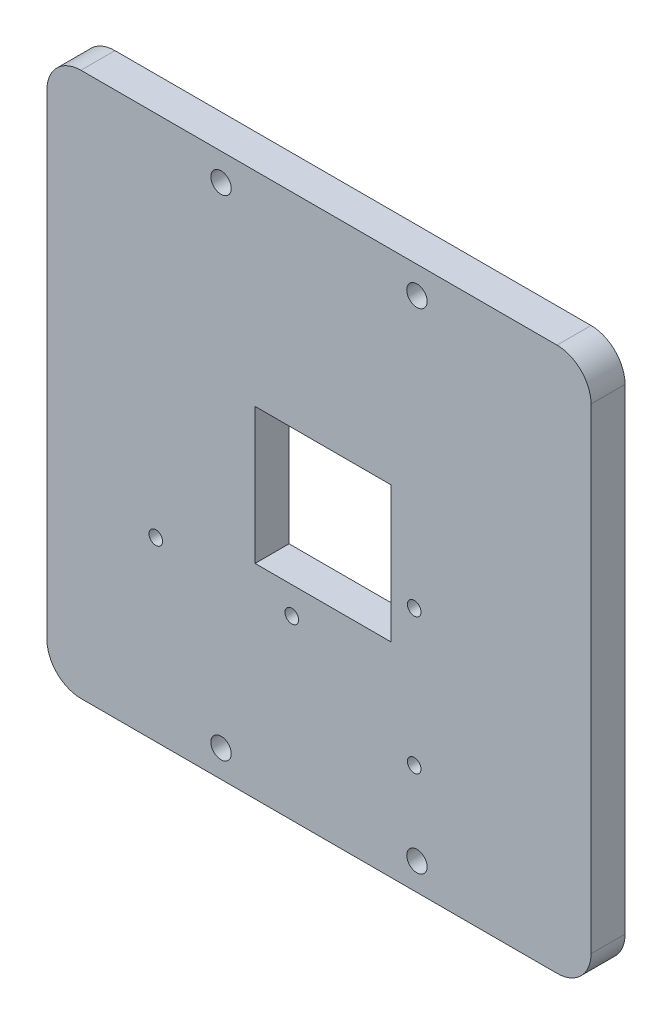
ISO-10303-21;
HEADER;
FILE_DESCRIPTION(('STEP AP214'),'2;1');
FILE_NAME('part.step','',(''),(''),'','','');
FILE_SCHEMA(('AUTOMOTIVE_DESIGN { 1 0 10303 214 1 1 1 1 }'));
ENDSEC;
DATA;
#1=APPLICATION_CONTEXT('core data for automotive mechanical design processes');
#2=APPLICATION_PROTOCOL_DEFINITION('international standard','automotive_design',2000,#1);
#3=PRODUCT_CONTEXT('',#1,'mechanical');
#4=PRODUCT('Part','Part','',(#3));
#5=PRODUCT_RELATED_PRODUCT_CATEGORY('part','',(#4));
#6=PRODUCT_DEFINITION_FORMATION('','',#4);
#7=PRODUCT_DEFINITION_CONTEXT('part definition',#1,'design');
#8=PRODUCT_DEFINITION('design','',#6,#7);
#9=PRODUCT_DEFINITION_SHAPE('','',#8);
#10=(LENGTH_UNIT() NAMED_UNIT(*) SI_UNIT(.MILLI.,.METRE.));
#11=(NAMED_UNIT(*) PLANE_ANGLE_UNIT() SI_UNIT($,.RADIAN.));
#12=(NAMED_UNIT(*) SI_UNIT($,.STERADIAN.) SOLID_ANGLE_UNIT());
#13=UNCERTAINTY_MEASURE_WITH_UNIT(LENGTH_MEASURE(1.E-05),#10,'distance_accuracy_value','');
#14=(GEOMETRIC_REPRESENTATION_CONTEXT(3) GLOBAL_UNCERTAINTY_ASSIGNED_CONTEXT((#13)) GLOBAL_UNIT_ASSIGNED_CONTEXT((#10,
#11,#12)) REPRESENTATION_CONTEXT('',''));
#15=CARTESIAN_POINT('',(0.,0.,0.));
#16=DIRECTION('',(0.,0.,1.));
#17=DIRECTION('',(1.,0.,0.));
#18=AXIS2_PLACEMENT_3D('',#15,#16,#17);
#19=CARTESIAN_POINT('',(5.,5.,5.));
#20=DIRECTION('',(0.,0.,-1.));
#21=DIRECTION('',(-1.,0.,0.));
#22=AXIS2_PLACEMENT_3D('',#19,#20,#21);
#23=PLANE('',#22);
#24=CARTESIAN_POINT('',(54.,36.,5.));
#25=DIRECTION('',(0.,0.,1.));
#26=DIRECTION('',(1.,0.,0.));
#27=AXIS2_PLACEMENT_3D('',#24,#25,#26);
#28=CIRCLE('',#27,0.999999999999998);
#29=CARTESIAN_POINT('',(55.,36.,5.));
#30=VERTEX_POINT('',#29);
#31=EDGE_CURVE('E512',#30,#30,#28,.T.);
#32=ORIENTED_EDGE('',*,*,#31,.F.);
#33=EDGE_LOOP('',(#32));
#34=FACE_BOUND('',#33,.T.);
#35=CARTESIAN_POINT('',(54.,16.,5.));
#36=DIRECTION('',(0.,0.,1.));
#37=DIRECTION('',(1.,0.,0.));
#38=AXIS2_PLACEMENT_3D('',#35,#36,#37);
#39=CIRCLE('',#38,0.999999999999998);
#40=CARTESIAN_POINT('',(55.,16.,5.));
#41=VERTEX_POINT('',#40);
#42=EDGE_CURVE('E517',#41,#41,#39,.T.);
#43=ORIENTED_EDGE('',*,*,#42,.F.);
#44=EDGE_LOOP('',(#43));
#45=FACE_BOUND('',#44,.T.);
#46=CARTESIAN_POINT('',(36.,26.,5.));
#47=DIRECTION('',(0.,0.,1.));
#48=DIRECTION('',(1.,0.,0.));
#49=AXIS2_PLACEMENT_3D('',#46,#47,#48);
#50=CIRCLE('',#49,0.999999999999998);
#51=CARTESIAN_POINT('',(37.,26.,5.));
#52=VERTEX_POINT('',#51);
#53=EDGE_CURVE('E525',#52,#52,#50,.T.);
#54=ORIENTED_EDGE('',*,*,#53,.F.);
#55=EDGE_LOOP('',(#54));
#56=FACE_BOUND('',#55,.T.);
#57=CARTESIAN_POINT('',(16.,26.,5.));
#58=DIRECTION('',(0.,0.,1.));
#59=DIRECTION('',(1.,0.,0.));
#60=AXIS2_PLACEMENT_3D('',#57,#58,#59);
#61=CIRCLE('',#60,1.);
#62=CARTESIAN_POINT('',(17.,26.,5.));
#63=VERTEX_POINT('',#62);
#64=EDGE_CURVE('E146',#63,#63,#61,.T.);
#65=ORIENTED_EDGE('',*,*,#64,.F.);
#66=EDGE_LOOP('',(#65));
#67=FACE_BOUND('',#66,.T.);
#68=DIRECTION('',(1.,0.,0.));
#69=VECTOR('',#68,1.);
#70=CARTESIAN_POINT('',(30.6,30.,5.));
#71=LINE('',#70,#69);
#72=CARTESIAN_POINT('',(30.6,30.,5.));
#73=VERTEX_POINT('',#72);
#74=CARTESIAN_POINT('',(50.6,30.,5.));
#75=VERTEX_POINT('',#74);
#76=EDGE_CURVE('E152',#73,#75,#71,.T.);
#77=ORIENTED_EDGE('',*,*,#76,.F.);
#78=DIRECTION('',(0.,-1.,0.));
#79=VECTOR('',#78,1.);
#80=CARTESIAN_POINT('',(30.6,50.,5.));
#81=LINE('',#80,#79);
#82=CARTESIAN_POINT('',(30.6,50.,5.));
#83=VERTEX_POINT('',#82);
#84=EDGE_CURVE('E48',#83,#73,#81,.T.);
#85=ORIENTED_EDGE('',*,*,#84,.F.);
#86=DIRECTION('',(-1.,0.,0.));
#87=VECTOR('',#86,1.);
#88=CARTESIAN_POINT('',(30.6,50.,5.));
#89=LINE('',#88,#87);
#90=CARTESIAN_POINT('',(50.6,50.,5.));
#91=VERTEX_POINT('',#90);
#92=EDGE_CURVE('E140',#91,#83,#89,.T.);
#93=ORIENTED_EDGE('',*,*,#92,.F.);
#94=DIRECTION('',(0.,1.,0.));
#95=VECTOR('',#94,1.);
#96=CARTESIAN_POINT('',(50.6,50.,5.));
#97=LINE('',#96,#95);
#98=EDGE_CURVE('E143',#75,#91,#97,.T.);
#99=ORIENTED_EDGE('',*,*,#98,.F.);
#100=EDGE_LOOP('',(#77,#85,#93,#99));
#101=FACE_BOUND('',#100,.T.);
#102=DIRECTION('',(-1.,0.,0.));
#103=VECTOR('',#102,1.);
#104=CARTESIAN_POINT('',(5.00000000000004,80.,5.));
#105=LINE('',#104,#103);
#106=CARTESIAN_POINT('',(74.9999999999999,80.,5.));
#107=VERTEX_POINT('',#106);
#108=CARTESIAN_POINT('',(5.00000000000003,80.,5.));
#109=VERTEX_POINT('',#108);
#110=EDGE_CURVE('E215',#107,#109,#105,.T.);
#111=ORIENTED_EDGE('',*,*,#110,.T.);
#112=CARTESIAN_POINT('',(5.,75.,5.));
#113=DIRECTION('',(0.,0.,1.));
#114=DIRECTION('',(-1.,0.,0.));
#115=AXIS2_PLACEMENT_3D('',#112,#113,#114);
#116=CIRCLE('',#115,5.);
#117=CARTESIAN_POINT('',(0.,75.,5.));
#118=VERTEX_POINT('',#117);
#119=EDGE_CURVE('E218',#109,#118,#116,.T.);
#120=ORIENTED_EDGE('',*,*,#119,.T.);
#121=DIRECTION('',(0.,-1.,0.));
#122=VECTOR('',#121,1.);
#123=CARTESIAN_POINT('',(0.,5.00000000000004,5.));
#124=LINE('',#123,#122);
#125=CARTESIAN_POINT('',(0.,5.,5.));
#126=VERTEX_POINT('',#125);
#127=EDGE_CURVE('E221',#118,#126,#124,.T.);
#128=ORIENTED_EDGE('',*,*,#127,.T.);
#129=CARTESIAN_POINT('',(5.,5.,5.));
#130=DIRECTION('',(0.,0.,1.));
#131=DIRECTION('',(-1.,0.,0.));
#132=AXIS2_PLACEMENT_3D('',#129,#130,#131);
#133=CIRCLE('',#132,5.);
#134=CARTESIAN_POINT('',(5.00000000000004,0.,5.));
#135=VERTEX_POINT('',#134);
#136=EDGE_CURVE('E223',#126,#135,#133,.T.);
#137=ORIENTED_EDGE('',*,*,#136,.T.);
#138=DIRECTION('',(1.,0.,0.));
#139=VECTOR('',#138,1.);
#140=CARTESIAN_POINT('',(5.00000000000004,0.,5.));
#141=LINE('',#140,#139);
#142=CARTESIAN_POINT('',(75.,0.,5.));
#143=VERTEX_POINT('',#142);
#144=EDGE_CURVE('E225',#135,#143,#141,.T.);
#145=ORIENTED_EDGE('',*,*,#144,.T.);
#146=CARTESIAN_POINT('',(75.,5.00000000000002,5.));
#147=DIRECTION('',(0.,0.,-1.));
#148=DIRECTION('',(1.,0.,0.));
#149=AXIS2_PLACEMENT_3D('',#146,#147,#148);
#150=CIRCLE('',#149,5.);
#151=CARTESIAN_POINT('',(80.,5.00000000000002,5.));
#152=VERTEX_POINT('',#151);
#153=EDGE_CURVE('E175',#152,#143,#150,.T.);
#154=ORIENTED_EDGE('',*,*,#153,.F.);
#155=DIRECTION('',(0.,-1.,0.));
#156=VECTOR('',#155,1.);
#157=CARTESIAN_POINT('',(80.,5.00000000000005,5.));
#158=LINE('',#157,#156);
#159=CARTESIAN_POINT('',(80.,75.,5.));
#160=VERTEX_POINT('',#159);
#161=EDGE_CURVE('E178',#160,#152,#158,.T.);
#162=ORIENTED_EDGE('',*,*,#161,.F.);
#163=CARTESIAN_POINT('',(75.,75.,5.));
#164=DIRECTION('',(0.,0.,-1.));
#165=DIRECTION('',(1.,0.,0.));
#166=AXIS2_PLACEMENT_3D('',#163,#164,#165);
#167=CIRCLE('',#166,5.);
#168=EDGE_CURVE('E182',#107,#160,#167,.T.);
#169=ORIENTED_EDGE('',*,*,#168,.F.);
#170=EDGE_LOOP('',(#111,#120,#128,#137,#145,#154,#162,#169));
#171=FACE_BOUND('',#170,.T.);
#172=CARTESIAN_POINT('',(25.6,76.,5.));
#173=DIRECTION('',(0.,0.,1.));
#174=DIRECTION('',(1.,0.,0.));
#175=AXIS2_PLACEMENT_3D('',#172,#173,#174);
#176=CIRCLE('',#175,1.5);
#177=CARTESIAN_POINT('',(27.1,76.,5.));
#178=VERTEX_POINT('',#177);
#179=EDGE_CURVE('E209',#178,#178,#176,.T.);
#180=ORIENTED_EDGE('',*,*,#179,.F.);
#181=EDGE_LOOP('',(#180));
#182=FACE_BOUND('',#181,.T.);
#183=CARTESIAN_POINT('',(25.6,4.,5.));
#184=DIRECTION('',(0.,0.,1.));
#185=DIRECTION('',(1.,0.,0.));
#186=AXIS2_PLACEMENT_3D('',#183,#184,#185);
#187=CIRCLE('',#186,1.5);
#188=CARTESIAN_POINT('',(27.1,4.,5.));
#189=VERTEX_POINT('',#188);
#190=EDGE_CURVE('E203',#189,#189,#187,.T.);
#191=ORIENTED_EDGE('',*,*,#190,.F.);
#192=EDGE_LOOP('',(#191));
#193=FACE_BOUND('',#192,.T.);
#194=CARTESIAN_POINT('',(54.4,4.00000000000001,5.));
#195=DIRECTION('',(0.,0.,-1.));
#196=DIRECTION('',(-1.,0.,0.));
#197=AXIS2_PLACEMENT_3D('',#194,#195,#196);
#198=CIRCLE('',#197,1.5);
#199=CARTESIAN_POINT('',(52.9,4.00000000000001,5.));
#200=VERTEX_POINT('',#199);
#201=EDGE_CURVE('E163',#200,#200,#198,.T.);
#202=ORIENTED_EDGE('',*,*,#201,.T.);
#203=EDGE_LOOP('',(#202));
#204=FACE_BOUND('',#203,.T.);
#205=CARTESIAN_POINT('',(54.4,76.,5.));
#206=DIRECTION('',(0.,0.,-1.));
#207=DIRECTION('',(-1.,0.,0.));
#208=AXIS2_PLACEMENT_3D('',#205,#206,#207);
#209=CIRCLE('',#208,1.5);
#210=CARTESIAN_POINT('',(52.9,76.,5.));
#211=VERTEX_POINT('',#210);
#212=EDGE_CURVE('E169',#211,#211,#209,.T.);
#213=ORIENTED_EDGE('',*,*,#212,.T.);
#214=EDGE_LOOP('',(#213));
#215=FACE_BOUND('',#214,.T.);
#216=ADVANCED_FACE('F33',(#34,#45,#56,#67,#101,#171,#182,#193,#204,#215),#23,.F.);
#217=CARTESIAN_POINT('',(5.,5.,0.));
#218=DIRECTION('',(0.,0.,-1.));
#219=DIRECTION('',(-1.,0.,0.));
#220=AXIS2_PLACEMENT_3D('',#217,#218,#219);
#221=PLANE('',#220);
#222=CARTESIAN_POINT('',(54.,36.,0.));
#223=DIRECTION('',(0.,0.,1.));
#224=DIRECTION('',(1.,0.,0.));
#225=AXIS2_PLACEMENT_3D('',#222,#223,#224);
#226=CIRCLE('',#225,0.999999999999998);
#227=CARTESIAN_POINT('',(55.,36.,0.));
#228=VERTEX_POINT('',#227);
#229=EDGE_CURVE('E153',#228,#228,#226,.T.);
#230=ORIENTED_EDGE('',*,*,#229,.T.);
#231=EDGE_LOOP('',(#230));
#232=FACE_BOUND('',#231,.T.);
#233=CARTESIAN_POINT('',(54.,16.,0.));
#234=DIRECTION('',(0.,0.,1.));
#235=DIRECTION('',(1.,0.,0.));
#236=AXIS2_PLACEMENT_3D('',#233,#234,#235);
#237=CIRCLE('',#236,0.999999999999998);
#238=CARTESIAN_POINT('',(55.,16.,0.));
#239=VERTEX_POINT('',#238);
#240=EDGE_CURVE('E513',#239,#239,#237,.T.);
#241=ORIENTED_EDGE('',*,*,#240,.T.);
#242=EDGE_LOOP('',(#241));
#243=FACE_BOUND('',#242,.T.);
#244=CARTESIAN_POINT('',(36.,26.,0.));
#245=DIRECTION('',(0.,0.,1.));
#246=DIRECTION('',(1.,0.,0.));
#247=AXIS2_PLACEMENT_3D('',#244,#245,#246);
#248=CIRCLE('',#247,0.999999999999998);
#249=CARTESIAN_POINT('',(37.,26.,0.));
#250=VERTEX_POINT('',#249);
#251=EDGE_CURVE('E522',#250,#250,#248,.T.);
#252=ORIENTED_EDGE('',*,*,#251,.T.);
#253=EDGE_LOOP('',(#252));
#254=FACE_BOUND('',#253,.T.);
#255=CARTESIAN_POINT('',(16.,26.,0.));
#256=DIRECTION('',(0.,0.,1.));
#257=DIRECTION('',(1.,0.,0.));
#258=AXIS2_PLACEMENT_3D('',#255,#256,#257);
#259=CIRCLE('',#258,1.);
#260=CARTESIAN_POINT('',(17.,26.,0.));
#261=VERTEX_POINT('',#260);
#262=EDGE_CURVE('E527',#261,#261,#259,.T.);
#263=ORIENTED_EDGE('',*,*,#262,.T.);
#264=EDGE_LOOP('',(#263));
#265=FACE_BOUND('',#264,.T.);
#266=DIRECTION('',(0.,-1.,0.));
#267=VECTOR('',#266,1.);
#268=CARTESIAN_POINT('',(30.6,50.,0.));
#269=LINE('',#268,#267);
#270=CARTESIAN_POINT('',(30.6,50.,0.));
#271=VERTEX_POINT('',#270);
#272=CARTESIAN_POINT('',(30.6,30.,0.));
#273=VERTEX_POINT('',#272);
#274=EDGE_CURVE('E124',#271,#273,#269,.T.);
#275=ORIENTED_EDGE('',*,*,#274,.T.);
#276=DIRECTION('',(1.,0.,0.));
#277=VECTOR('',#276,1.);
#278=CARTESIAN_POINT('',(30.6,30.,0.));
#279=LINE('',#278,#277);
#280=CARTESIAN_POINT('',(50.6,30.,0.));
#281=VERTEX_POINT('',#280);
#282=EDGE_CURVE('E133',#273,#281,#279,.T.);
#283=ORIENTED_EDGE('',*,*,#282,.T.);
#284=DIRECTION('',(0.,1.,0.));
#285=VECTOR('',#284,1.);
#286=CARTESIAN_POINT('',(50.6,50.,0.));
#287=LINE('',#286,#285);
#288=CARTESIAN_POINT('',(50.6,50.,0.));
#289=VERTEX_POINT('',#288);
#290=EDGE_CURVE('E56',#281,#289,#287,.T.);
#291=ORIENTED_EDGE('',*,*,#290,.T.);
#292=DIRECTION('',(-1.,0.,0.));
#293=VECTOR('',#292,1.);
#294=CARTESIAN_POINT('',(30.6,50.,0.));
#295=LINE('',#294,#293);
#296=EDGE_CURVE('E130',#289,#271,#295,.T.);
#297=ORIENTED_EDGE('',*,*,#296,.T.);
#298=EDGE_LOOP('',(#275,#283,#291,#297));
#299=FACE_BOUND('',#298,.T.);
#300=CARTESIAN_POINT('',(25.6,76.,0.));
#301=DIRECTION('',(0.,0.,1.));
#302=DIRECTION('',(1.,0.,0.));
#303=AXIS2_PLACEMENT_3D('',#300,#301,#302);
#304=CIRCLE('',#303,1.5);
#305=CARTESIAN_POINT('',(27.1,76.,0.));
#306=VERTEX_POINT('',#305);
#307=EDGE_CURVE('E206',#306,#306,#304,.T.);
#308=ORIENTED_EDGE('',*,*,#307,.T.);
#309=EDGE_LOOP('',(#308));
#310=FACE_BOUND('',#309,.T.);
#311=DIRECTION('',(-1.,0.,0.));
#312=VECTOR('',#311,1.);
#313=CARTESIAN_POINT('',(5.00000000000004,80.,0.));
#314=LINE('',#313,#312);
#315=CARTESIAN_POINT('',(74.9999999999999,80.,0.));
#316=VERTEX_POINT('',#315);
#317=CARTESIAN_POINT('',(5.00000000000003,80.,0.));
#318=VERTEX_POINT('',#317);
#319=EDGE_CURVE('E212',#316,#318,#314,.T.);
#320=ORIENTED_EDGE('',*,*,#319,.F.);
#321=CARTESIAN_POINT('',(75.,75.,0.));
#322=DIRECTION('',(0.,0.,-1.));
#323=DIRECTION('',(1.,0.,0.));
#324=AXIS2_PLACEMENT_3D('',#321,#322,#323);
#325=CIRCLE('',#324,5.);
#326=CARTESIAN_POINT('',(80.,75.,0.));
#327=VERTEX_POINT('',#326);
#328=EDGE_CURVE('E179',#316,#327,#325,.T.);
#329=ORIENTED_EDGE('',*,*,#328,.T.);
#330=DIRECTION('',(0.,-1.,0.));
#331=VECTOR('',#330,1.);
#332=CARTESIAN_POINT('',(80.,5.00000000000005,0.));
#333=LINE('',#332,#331);
#334=CARTESIAN_POINT('',(80.,5.00000000000002,0.));
#335=VERTEX_POINT('',#334);
#336=EDGE_CURVE('E188',#327,#335,#333,.T.);
#337=ORIENTED_EDGE('',*,*,#336,.T.);
#338=CARTESIAN_POINT('',(75.,5.00000000000002,0.));
#339=DIRECTION('',(0.,0.,-1.));
#340=DIRECTION('',(1.,0.,0.));
#341=AXIS2_PLACEMENT_3D('',#338,#339,#340);
#342=CIRCLE('',#341,5.);
#343=CARTESIAN_POINT('',(75.,0.,0.));
#344=VERTEX_POINT('',#343);
#345=EDGE_CURVE('E172',#335,#344,#342,.T.);
#346=ORIENTED_EDGE('',*,*,#345,.T.);
#347=DIRECTION('',(1.,0.,0.));
#348=VECTOR('',#347,1.);
#349=CARTESIAN_POINT('',(5.00000000000004,0.,0.));
#350=LINE('',#349,#348);
#351=CARTESIAN_POINT('',(5.00000000000004,0.,0.));
#352=VERTEX_POINT('',#351);
#353=EDGE_CURVE('E219',#352,#344,#350,.T.);
#354=ORIENTED_EDGE('',*,*,#353,.F.);
#355=CARTESIAN_POINT('',(5.,5.,0.));
#356=DIRECTION('',(0.,0.,1.));
#357=DIRECTION('',(-1.,0.,0.));
#358=AXIS2_PLACEMENT_3D('',#355,#356,#357);
#359=CIRCLE('',#358,5.);
#360=CARTESIAN_POINT('',(0.,5.,0.));
#361=VERTEX_POINT('',#360);
#362=EDGE_CURVE('E234',#361,#352,#359,.T.);
#363=ORIENTED_EDGE('',*,*,#362,.F.);
#364=DIRECTION('',(0.,-1.,0.));
#365=VECTOR('',#364,1.);
#366=CARTESIAN_POINT('',(0.,5.00000000000004,0.));
#367=LINE('',#366,#365);
#368=CARTESIAN_POINT('',(0.,75.,0.));
#369=VERTEX_POINT('',#368);
#370=EDGE_CURVE('E232',#369,#361,#367,.T.);
#371=ORIENTED_EDGE('',*,*,#370,.F.);
#372=CARTESIAN_POINT('',(5.,75.,0.));
#373=DIRECTION('',(0.,0.,1.));
#374=DIRECTION('',(-1.,0.,0.));
#375=AXIS2_PLACEMENT_3D('',#372,#373,#374);
#376=CIRCLE('',#375,5.);
#377=EDGE_CURVE('E230',#318,#369,#376,.T.);
#378=ORIENTED_EDGE('',*,*,#377,.F.);
#379=EDGE_LOOP('',(#320,#329,#337,#346,#354,#363,#371,#378));
#380=FACE_BOUND('',#379,.T.);
#381=CARTESIAN_POINT('',(25.6,4.,0.));
#382=DIRECTION('',(0.,0.,1.));
#383=DIRECTION('',(1.,0.,0.));
#384=AXIS2_PLACEMENT_3D('',#381,#382,#383);
#385=CIRCLE('',#384,1.5);
#386=CARTESIAN_POINT('',(27.1,4.,0.));
#387=VERTEX_POINT('',#386);
#388=EDGE_CURVE('E202',#387,#387,#385,.T.);
#389=ORIENTED_EDGE('',*,*,#388,.T.);
#390=EDGE_LOOP('',(#389));
#391=FACE_BOUND('',#390,.T.);
#392=CARTESIAN_POINT('',(54.4,4.00000000000001,0.));
#393=DIRECTION('',(0.,0.,-1.));
#394=DIRECTION('',(-1.,0.,0.));
#395=AXIS2_PLACEMENT_3D('',#392,#393,#394);
#396=CIRCLE('',#395,1.5);
#397=CARTESIAN_POINT('',(52.9,4.00000000000001,0.));
#398=VERTEX_POINT('',#397);
#399=EDGE_CURVE('E159',#398,#398,#396,.T.);
#400=ORIENTED_EDGE('',*,*,#399,.F.);
#401=EDGE_LOOP('',(#400));
#402=FACE_BOUND('',#401,.T.);
#403=CARTESIAN_POINT('',(54.4,76.,0.));
#404=DIRECTION('',(0.,0.,-1.));
#405=DIRECTION('',(-1.,0.,0.));
#406=AXIS2_PLACEMENT_3D('',#403,#404,#405);
#407=CIRCLE('',#406,1.5);
#408=CARTESIAN_POINT('',(52.9,76.,0.));
#409=VERTEX_POINT('',#408);
#410=EDGE_CURVE('E166',#409,#409,#407,.T.);
#411=ORIENTED_EDGE('',*,*,#410,.F.);
#412=EDGE_LOOP('',(#411));
#413=FACE_BOUND('',#412,.T.);
#414=ADVANCED_FACE('F137',(#232,#243,#254,#265,#299,#310,#380,#391,#402,#413),#221,.T.);
#415=CARTESIAN_POINT('',(5.00000000000004,80.,5.));
#416=DIRECTION('',(0.,-1.,0.));
#417=DIRECTION('',(0.,0.,-1.));
#418=AXIS2_PLACEMENT_3D('',#415,#416,#417);
#419=PLANE('',#418);
#420=ORIENTED_EDGE('',*,*,#319,.T.);
#421=DIRECTION('',(0.,0.,-1.));
#422=VECTOR('',#421,1.);
#423=CARTESIAN_POINT('',(5.00000000000003,80.,5.));
#424=LINE('',#423,#422);
#425=EDGE_CURVE('E11',#109,#318,#424,.T.);
#426=ORIENTED_EDGE('',*,*,#425,.F.);
#427=ORIENTED_EDGE('',*,*,#110,.F.);
#428=DIRECTION('',(0.,0.,-1.));
#429=VECTOR('',#428,1.);
#430=CARTESIAN_POINT('',(74.9999999999999,80.,5.));
#431=LINE('',#430,#429);
#432=EDGE_CURVE('E185',#107,#316,#431,.T.);
#433=ORIENTED_EDGE('',*,*,#432,.T.);
#434=EDGE_LOOP('',(#420,#426,#427,#433));
#435=FACE_BOUND('',#434,.T.);
#436=ADVANCED_FACE('F35',(#435),#419,.F.);
#437=CARTESIAN_POINT('',(5.,75.,5.));
#438=DIRECTION('',(0.,0.,-1.));
#439=DIRECTION('',(-1.,0.,0.));
#440=AXIS2_PLACEMENT_3D('',#437,#438,#439);
#441=CYLINDRICAL_SURFACE('',#440,5.);
#442=ORIENTED_EDGE('',*,*,#377,.T.);
#443=DIRECTION('',(0.,0.,-1.));
#444=VECTOR('',#443,1.);
#445=CARTESIAN_POINT('',(0.,75.,5.));
#446=LINE('',#445,#444);
#447=EDGE_CURVE('E41',#118,#369,#446,.T.);
#448=ORIENTED_EDGE('',*,*,#447,.F.);
#449=ORIENTED_EDGE('',*,*,#119,.F.);
#450=ORIENTED_EDGE('',*,*,#425,.T.);
#451=EDGE_LOOP('',(#442,#448,#449,#450));
#452=FACE_BOUND('',#451,.T.);
#453=ADVANCED_FACE('F267',(#452),#441,.T.);
#454=CARTESIAN_POINT('',(0.,5.00000000000004,5.));
#455=DIRECTION('',(1.,0.,0.));
#456=DIRECTION('',(0.,0.,-1.));
#457=AXIS2_PLACEMENT_3D('',#454,#455,#456);
#458=PLANE('',#457);
#459=ORIENTED_EDGE('',*,*,#370,.T.);
#460=DIRECTION('',(0.,0.,-1.));
#461=VECTOR('',#460,1.);
#462=CARTESIAN_POINT('',(0.,5.,5.));
#463=LINE('',#462,#461);
#464=EDGE_CURVE('E239',#126,#361,#463,.T.);
#465=ORIENTED_EDGE('',*,*,#464,.F.);
#466=ORIENTED_EDGE('',*,*,#127,.F.);
#467=ORIENTED_EDGE('',*,*,#447,.T.);
#468=EDGE_LOOP('',(#459,#465,#466,#467));
#469=FACE_BOUND('',#468,.T.);
#470=ADVANCED_FACE('F246',(#469),#458,.F.);
#471=CARTESIAN_POINT('',(5.,5.,5.));
#472=DIRECTION('',(0.,0.,-1.));
#473=DIRECTION('',(-1.,0.,0.));
#474=AXIS2_PLACEMENT_3D('',#471,#472,#473);
#475=CYLINDRICAL_SURFACE('',#474,5.);
#476=ORIENTED_EDGE('',*,*,#362,.T.);
#477=DIRECTION('',(0.,0.,-1.));
#478=VECTOR('',#477,1.);
#479=CARTESIAN_POINT('',(5.00000000000004,0.,5.));
#480=LINE('',#479,#478);
#481=EDGE_CURVE('E227',#135,#352,#480,.T.);
#482=ORIENTED_EDGE('',*,*,#481,.F.);
#483=ORIENTED_EDGE('',*,*,#136,.F.);
#484=ORIENTED_EDGE('',*,*,#464,.T.);
#485=EDGE_LOOP('',(#476,#482,#483,#484));
#486=FACE_BOUND('',#485,.T.);
#487=ADVANCED_FACE('F255',(#486),#475,.T.);
#488=CARTESIAN_POINT('',(5.00000000000004,0.,5.));
#489=DIRECTION('',(0.,1.,0.));
#490=DIRECTION('',(0.,0.,1.));
#491=AXIS2_PLACEMENT_3D('',#488,#489,#490);
#492=PLANE('',#491);
#493=ORIENTED_EDGE('',*,*,#353,.T.);
#494=DIRECTION('',(0.,0.,-1.));
#495=VECTOR('',#494,1.);
#496=CARTESIAN_POINT('',(75.,0.,5.));
#497=LINE('',#496,#495);
#498=EDGE_CURVE('E199',#143,#344,#497,.T.);
#499=ORIENTED_EDGE('',*,*,#498,.F.);
#500=ORIENTED_EDGE('',*,*,#144,.F.);
#501=ORIENTED_EDGE('',*,*,#481,.T.);
#502=EDGE_LOOP('',(#493,#499,#500,#501));
#503=FACE_BOUND('',#502,.T.);
#504=ADVANCED_FACE('F259',(#503),#492,.F.);
#505=CARTESIAN_POINT('',(25.6,76.,5.));
#506=DIRECTION('',(0.,0.,-1.));
#507=DIRECTION('',(-1.,0.,0.));
#508=AXIS2_PLACEMENT_3D('',#505,#506,#507);
#509=CYLINDRICAL_SURFACE('',#508,1.5);
#510=ORIENTED_EDGE('',*,*,#179,.T.);
#511=EDGE_LOOP('',(#510));
#512=FACE_BOUND('',#511,.T.);
#513=ORIENTED_EDGE('',*,*,#307,.F.);
#514=EDGE_LOOP('',(#513));
#515=FACE_BOUND('',#514,.T.);
#516=ADVANCED_FACE('F287',(#512,#515),#509,.F.);
#517=CARTESIAN_POINT('',(25.6,4.,5.));
#518=DIRECTION('',(0.,0.,-1.));
#519=DIRECTION('',(-1.,0.,0.));
#520=AXIS2_PLACEMENT_3D('',#517,#518,#519);
#521=CYLINDRICAL_SURFACE('',#520,1.5);
#522=ORIENTED_EDGE('',*,*,#190,.T.);
#523=EDGE_LOOP('',(#522));
#524=FACE_BOUND('',#523,.T.);
#525=ORIENTED_EDGE('',*,*,#388,.F.);
#526=EDGE_LOOP('',(#525));
#527=FACE_BOUND('',#526,.T.);
#528=ADVANCED_FACE('F280',(#524,#527),#521,.F.);
#529=CARTESIAN_POINT('',(75.,5.00000000000002,5.));
#530=DIRECTION('',(0.,0.,-1.));
#531=DIRECTION('',(-1.,0.,0.));
#532=AXIS2_PLACEMENT_3D('',#529,#530,#531);
#533=CYLINDRICAL_SURFACE('',#532,5.);
#534=ORIENTED_EDGE('',*,*,#345,.F.);
#535=DIRECTION('',(0.,0.,-1.));
#536=VECTOR('',#535,1.);
#537=CARTESIAN_POINT('',(80.,5.00000000000002,5.));
#538=LINE('',#537,#536);
#539=EDGE_CURVE('E197',#152,#335,#538,.T.);
#540=ORIENTED_EDGE('',*,*,#539,.F.);
#541=ORIENTED_EDGE('',*,*,#153,.T.);
#542=ORIENTED_EDGE('',*,*,#498,.T.);
#543=EDGE_LOOP('',(#534,#540,#541,#542));
#544=FACE_BOUND('',#543,.T.);
#545=ADVANCED_FACE('F278',(#544),#533,.T.);
#546=CARTESIAN_POINT('',(80.,5.00000000000005,5.));
#547=DIRECTION('',(1.,0.,0.));
#548=DIRECTION('',(0.,1.,0.));
#549=AXIS2_PLACEMENT_3D('',#546,#547,#548);
#550=PLANE('',#549);
#551=ORIENTED_EDGE('',*,*,#336,.F.);
#552=DIRECTION('',(0.,0.,-1.));
#553=VECTOR('',#552,1.);
#554=CARTESIAN_POINT('',(80.,75.,5.));
#555=LINE('',#554,#553);
#556=EDGE_CURVE('E195',#160,#327,#555,.T.);
#557=ORIENTED_EDGE('',*,*,#556,.F.);
#558=ORIENTED_EDGE('',*,*,#161,.T.);
#559=ORIENTED_EDGE('',*,*,#539,.T.);
#560=EDGE_LOOP('',(#551,#557,#558,#559));
#561=FACE_BOUND('',#560,.T.);
#562=ADVANCED_FACE('F275',(#561),#550,.T.);
#563=CARTESIAN_POINT('',(75.,75.,5.));
#564=DIRECTION('',(0.,0.,-1.));
#565=DIRECTION('',(-1.,0.,0.));
#566=AXIS2_PLACEMENT_3D('',#563,#564,#565);
#567=CYLINDRICAL_SURFACE('',#566,5.);
#568=ORIENTED_EDGE('',*,*,#328,.F.);
#569=ORIENTED_EDGE('',*,*,#432,.F.);
#570=ORIENTED_EDGE('',*,*,#168,.T.);
#571=ORIENTED_EDGE('',*,*,#556,.T.);
#572=EDGE_LOOP('',(#568,#569,#570,#571));
#573=FACE_BOUND('',#572,.T.);
#574=ADVANCED_FACE('F273',(#573),#567,.T.);
#575=CARTESIAN_POINT('',(54.4,76.,5.));
#576=DIRECTION('',(0.,0.,-1.));
#577=DIRECTION('',(-1.,0.,0.));
#578=AXIS2_PLACEMENT_3D('',#575,#576,#577);
#579=CYLINDRICAL_SURFACE('',#578,1.5);
#580=ORIENTED_EDGE('',*,*,#212,.F.);
#581=EDGE_LOOP('',(#580));
#582=FACE_BOUND('',#581,.T.);
#583=ORIENTED_EDGE('',*,*,#410,.T.);
#584=EDGE_LOOP('',(#583));
#585=FACE_BOUND('',#584,.T.);
#586=ADVANCED_FACE('F385',(#582,#585),#579,.F.);
#587=CARTESIAN_POINT('',(54.4,4.00000000000001,5.));
#588=DIRECTION('',(0.,0.,-1.));
#589=DIRECTION('',(-1.,0.,0.));
#590=AXIS2_PLACEMENT_3D('',#587,#588,#589);
#591=CYLINDRICAL_SURFACE('',#590,1.5);
#592=ORIENTED_EDGE('',*,*,#201,.F.);
#593=EDGE_LOOP('',(#592));
#594=FACE_BOUND('',#593,.T.);
#595=ORIENTED_EDGE('',*,*,#399,.T.);
#596=EDGE_LOOP('',(#595));
#597=FACE_BOUND('',#596,.T.);
#598=ADVANCED_FACE('F382',(#594,#597),#591,.F.);
#599=CARTESIAN_POINT('',(30.6,50.,0.));
#600=DIRECTION('',(-1.,0.,0.));
#601=DIRECTION('',(0.,-1.,0.));
#602=AXIS2_PLACEMENT_3D('',#599,#600,#601);
#603=PLANE('',#602);
#604=ORIENTED_EDGE('',*,*,#84,.T.);
#605=DIRECTION('',(0.,0.,1.));
#606=VECTOR('',#605,1.);
#607=CARTESIAN_POINT('',(30.6,30.,0.));
#608=LINE('',#607,#606);
#609=EDGE_CURVE('E120',#273,#73,#608,.T.);
#610=ORIENTED_EDGE('',*,*,#609,.F.);
#611=ORIENTED_EDGE('',*,*,#274,.F.);
#612=DIRECTION('',(0.,0.,1.));
#613=VECTOR('',#612,1.);
#614=CARTESIAN_POINT('',(30.6,50.,0.));
#615=LINE('',#614,#613);
#616=EDGE_CURVE('E157',#271,#83,#615,.T.);
#617=ORIENTED_EDGE('',*,*,#616,.T.);
#618=EDGE_LOOP('',(#604,#610,#611,#617));
#619=FACE_BOUND('',#618,.T.);
#620=ADVANCED_FACE('F122',(#619),#603,.F.);
#621=CARTESIAN_POINT('',(30.6,50.,0.));
#622=DIRECTION('',(0.,1.,0.));
#623=DIRECTION('',(0.,0.,1.));
#624=AXIS2_PLACEMENT_3D('',#621,#622,#623);
#625=PLANE('',#624);
#626=ORIENTED_EDGE('',*,*,#92,.T.);
#627=ORIENTED_EDGE('',*,*,#616,.F.);
#628=ORIENTED_EDGE('',*,*,#296,.F.);
#629=DIRECTION('',(0.,0.,1.));
#630=VECTOR('',#629,1.);
#631=CARTESIAN_POINT('',(50.6,50.,0.));
#632=LINE('',#631,#630);
#633=EDGE_CURVE('E160',#289,#91,#632,.T.);
#634=ORIENTED_EDGE('',*,*,#633,.T.);
#635=EDGE_LOOP('',(#626,#627,#628,#634));
#636=FACE_BOUND('',#635,.T.);
#637=ADVANCED_FACE('F372',(#636),#625,.F.);
#638=CARTESIAN_POINT('',(50.6,50.,0.));
#639=DIRECTION('',(1.,0.,0.));
#640=DIRECTION('',(0.,0.,-1.));
#641=AXIS2_PLACEMENT_3D('',#638,#639,#640);
#642=PLANE('',#641);
#643=ORIENTED_EDGE('',*,*,#98,.T.);
#644=ORIENTED_EDGE('',*,*,#633,.F.);
#645=ORIENTED_EDGE('',*,*,#290,.F.);
#646=DIRECTION('',(0.,0.,1.));
#647=VECTOR('',#646,1.);
#648=CARTESIAN_POINT('',(50.6,30.,0.));
#649=LINE('',#648,#647);
#650=EDGE_CURVE('E129',#281,#75,#649,.T.);
#651=ORIENTED_EDGE('',*,*,#650,.T.);
#652=EDGE_LOOP('',(#643,#644,#645,#651));
#653=FACE_BOUND('',#652,.T.);
#654=ADVANCED_FACE('F375',(#653),#642,.F.);
#655=CARTESIAN_POINT('',(30.6,30.,0.));
#656=DIRECTION('',(0.,-1.,0.));
#657=DIRECTION('',(0.,0.,-1.));
#658=AXIS2_PLACEMENT_3D('',#655,#656,#657);
#659=PLANE('',#658);
#660=ORIENTED_EDGE('',*,*,#76,.T.);
#661=ORIENTED_EDGE('',*,*,#650,.F.);
#662=ORIENTED_EDGE('',*,*,#282,.F.);
#663=ORIENTED_EDGE('',*,*,#609,.T.);
#664=EDGE_LOOP('',(#660,#661,#662,#663));
#665=FACE_BOUND('',#664,.T.);
#666=ADVANCED_FACE('F134',(#665),#659,.F.);
#667=CARTESIAN_POINT('',(16.,26.,0.));
#668=DIRECTION('',(0.,0.,1.));
#669=DIRECTION('',(1.,0.,0.));
#670=AXIS2_PLACEMENT_3D('',#667,#668,#669);
#671=CYLINDRICAL_SURFACE('',#670,1.);
#672=ORIENTED_EDGE('',*,*,#262,.F.);
#673=EDGE_LOOP('',(#672));
#674=FACE_BOUND('',#673,.T.);
#675=ORIENTED_EDGE('',*,*,#64,.T.);
#676=EDGE_LOOP('',(#675));
#677=FACE_BOUND('',#676,.T.);
#678=ADVANCED_FACE('F328',(#674,#677),#671,.F.);
#679=CARTESIAN_POINT('',(36.,26.,0.));
#680=DIRECTION('',(0.,0.,1.));
#681=DIRECTION('',(1.,0.,0.));
#682=AXIS2_PLACEMENT_3D('',#679,#680,#681);
#683=CYLINDRICAL_SURFACE('',#682,0.999999999999998);
#684=ORIENTED_EDGE('',*,*,#251,.F.);
#685=EDGE_LOOP('',(#684));
#686=FACE_BOUND('',#685,.T.);
#687=ORIENTED_EDGE('',*,*,#53,.T.);
#688=EDGE_LOOP('',(#687));
#689=FACE_BOUND('',#688,.T.);
#690=ADVANCED_FACE('F333',(#686,#689),#683,.F.);
#691=CARTESIAN_POINT('',(54.,16.,0.));
#692=DIRECTION('',(0.,0.,1.));
#693=DIRECTION('',(1.,0.,0.));
#694=AXIS2_PLACEMENT_3D('',#691,#692,#693);
#695=CYLINDRICAL_SURFACE('',#694,0.999999999999998);
#696=ORIENTED_EDGE('',*,*,#240,.F.);
#697=EDGE_LOOP('',(#696));
#698=FACE_BOUND('',#697,.T.);
#699=ORIENTED_EDGE('',*,*,#42,.T.);
#700=EDGE_LOOP('',(#699));
#701=FACE_BOUND('',#700,.T.);
#702=ADVANCED_FACE('F345',(#698,#701),#695,.F.);
#703=CARTESIAN_POINT('',(54.,36.,0.));
#704=DIRECTION('',(0.,0.,1.));
#705=DIRECTION('',(1.,0.,0.));
#706=AXIS2_PLACEMENT_3D('',#703,#704,#705);
#707=CYLINDRICAL_SURFACE('',#706,0.999999999999998);
#708=ORIENTED_EDGE('',*,*,#229,.F.);
#709=EDGE_LOOP('',(#708));
#710=FACE_BOUND('',#709,.T.);
#711=ORIENTED_EDGE('',*,*,#31,.T.);
#712=EDGE_LOOP('',(#711));
#713=FACE_BOUND('',#712,.T.);
#714=ADVANCED_FACE('F355',(#710,#713),#707,.F.);
#715=CLOSED_SHELL('',(#216,#414,#436,#453,#470,#487,#504,#516,#528,#545,#562,#574,#586,#598,
#620,#637,#654,#666,#678,#690,#702,#714));
#716=MANIFOLD_SOLID_BREP('B2',#715);
#717=ADVANCED_BREP_SHAPE_REPRESENTATION('',(#18,#716),#14);
#718=SHAPE_DEFINITION_REPRESENTATION(#9,#717);
ENDSEC;
END-ISO-10303-21;
